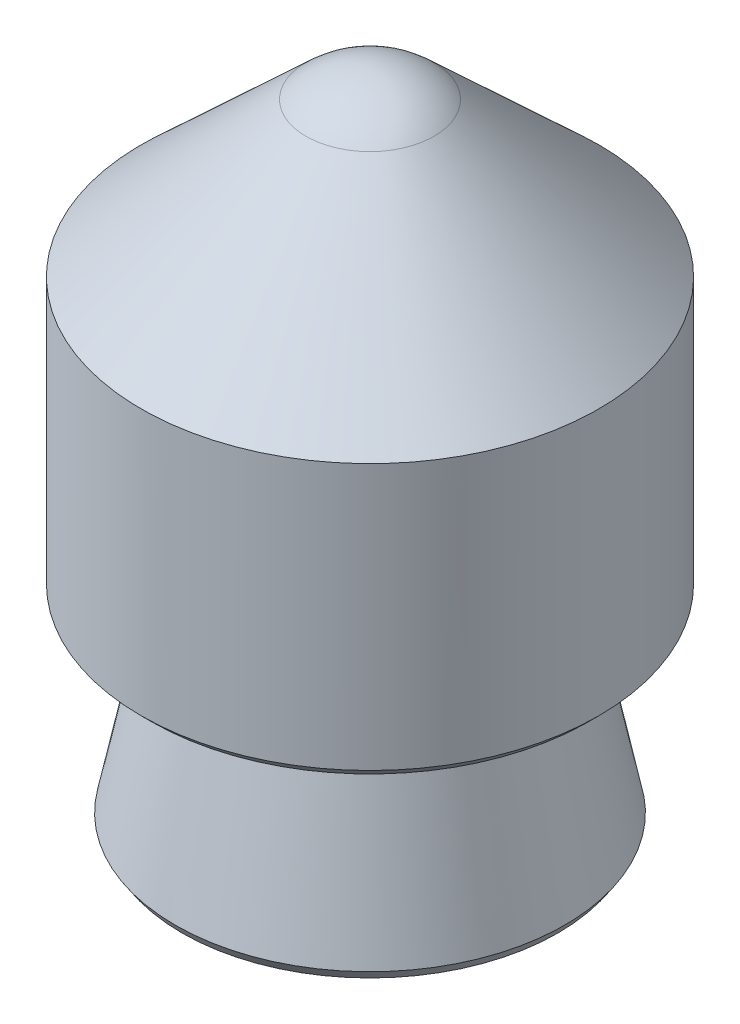
ISO-10303-21;
HEADER;
FILE_DESCRIPTION(('STEP AP214'),'2;1');
FILE_NAME('part.step','',(''),(''),'','','');
FILE_SCHEMA(('AUTOMOTIVE_DESIGN { 1 0 10303 214 1 1 1 1 }'));
ENDSEC;
DATA;
#1=APPLICATION_CONTEXT('core data for automotive mechanical design processes');
#2=APPLICATION_PROTOCOL_DEFINITION('international standard','automotive_design',2000,#1);
#3=PRODUCT_CONTEXT('',#1,'mechanical');
#4=PRODUCT('Part','Part','',(#3));
#5=PRODUCT_RELATED_PRODUCT_CATEGORY('part','',(#4));
#6=PRODUCT_DEFINITION_FORMATION('','',#4);
#7=PRODUCT_DEFINITION_CONTEXT('part definition',#1,'design');
#8=PRODUCT_DEFINITION('design','',#6,#7);
#9=PRODUCT_DEFINITION_SHAPE('','',#8);
#10=(LENGTH_UNIT() NAMED_UNIT(*) SI_UNIT(.MILLI.,.METRE.));
#11=(NAMED_UNIT(*) PLANE_ANGLE_UNIT() SI_UNIT($,.RADIAN.));
#12=(NAMED_UNIT(*) SI_UNIT($,.STERADIAN.) SOLID_ANGLE_UNIT());
#13=UNCERTAINTY_MEASURE_WITH_UNIT(LENGTH_MEASURE(1.E-05),#10,'distance_accuracy_value','');
#14=(GEOMETRIC_REPRESENTATION_CONTEXT(3) GLOBAL_UNCERTAINTY_ASSIGNED_CONTEXT((#13)) GLOBAL_UNIT_ASSIGNED_CONTEXT((#10,
#11,#12)) REPRESENTATION_CONTEXT('',''));
#15=CARTESIAN_POINT('',(0.,0.,0.));
#16=DIRECTION('',(0.,0.,1.));
#17=DIRECTION('',(1.,0.,0.));
#18=AXIS2_PLACEMENT_3D('',#15,#16,#17);
#19=CARTESIAN_POINT('',(0.,25.4,0.));
#20=DIRECTION('',(0.,1.,0.));
#21=DIRECTION('',(0.,0.,1.));
#22=AXIS2_PLACEMENT_3D('',#19,#20,#21);
#23=PLANE('',#22);
#24=CARTESIAN_POINT('',(0.,25.4,0.));
#25=DIRECTION('',(0.,-1.,0.));
#26=DIRECTION('',(0.,0.,-1.));
#27=AXIS2_PLACEMENT_3D('',#24,#25,#26);
#28=CIRCLE('',#27,3.5);
#29=CARTESIAN_POINT('',(0.,25.4,-3.5));
#30=VERTEX_POINT('',#29);
#31=EDGE_CURVE('E73',#30,#30,#28,.T.);
#32=ORIENTED_EDGE('',*,*,#31,.F.);
#33=EDGE_LOOP('',(#32));
#34=FACE_BOUND('',#33,.T.);
#35=CARTESIAN_POINT('',(0.,25.4,0.));
#36=DIRECTION('',(0.,1.,0.));
#37=DIRECTION('',(0.,0.,1.));
#38=AXIS2_PLACEMENT_3D('',#35,#36,#37);
#39=CIRCLE('',#38,4.59156114236063);
#40=CARTESIAN_POINT('',(0.,25.4,4.59156114236063));
#41=VERTEX_POINT('',#40);
#42=EDGE_CURVE('E58',#41,#41,#39,.F.);
#43=ORIENTED_EDGE('',*,*,#42,.T.);
#44=EDGE_LOOP('',(#43));
#45=FACE_BOUND('',#44,.T.);
#46=ADVANCED_FACE('F50',(#34,#45),#23,.F.);
#47=CARTESIAN_POINT('',(0.,30.2387,0.));
#48=DIRECTION('',(0.,-1.,0.));
#49=DIRECTION('',(0.,0.,-1.));
#50=AXIS2_PLACEMENT_3D('',#47,#48,#49);
#51=CONICAL_SURFACE('',#50,3.8227,0.200674236626133);
#52=CARTESIAN_POINT('',(0.,25.6489028308561,0.));
#53=DIRECTION('',(0.,1.,0.));
#54=DIRECTION('',(0.,0.,1.));
#55=AXIS2_PLACEMENT_3D('',#52,#53,#54);
#56=CIRCLE('',#55,4.75632015907782);
#57=CARTESIAN_POINT('',(0.,25.6489028308561,4.75632015907782));
#58=VERTEX_POINT('',#57);
#59=EDGE_CURVE('E13',#58,#58,#56,.T.);
#60=ORIENTED_EDGE('',*,*,#59,.T.);
#61=EDGE_LOOP('',(#60));
#62=FACE_BOUND('',#61,.T.);
#63=CARTESIAN_POINT('',(0.,30.2387,0.));
#64=DIRECTION('',(0.,-1.,0.));
#65=DIRECTION('',(0.,0.,-1.));
#66=AXIS2_PLACEMENT_3D('',#63,#64,#65);
#67=CIRCLE('',#66,3.8227);
#68=CARTESIAN_POINT('',(0.,30.2387,-3.8227));
#69=VERTEX_POINT('',#68);
#70=EDGE_CURVE('E86',#69,#69,#67,.T.);
#71=ORIENTED_EDGE('',*,*,#70,.T.);
#72=EDGE_LOOP('',(#71));
#73=FACE_BOUND('',#72,.T.);
#74=ADVANCED_FACE('F113',(#62,#73),#51,.T.);
#75=CARTESIAN_POINT('',(-3.8227,30.2387,0.));
#76=DIRECTION('',(0.,1.,0.));
#77=DIRECTION('',(0.,0.,1.));
#78=AXIS2_PLACEMENT_3D('',#75,#76,#77);
#79=PLANE('',#78);
#80=CARTESIAN_POINT('',(0.,30.2387,0.));
#81=DIRECTION('',(0.,1.,0.));
#82=DIRECTION('',(0.,0.,1.));
#83=AXIS2_PLACEMENT_3D('',#80,#81,#82);
#84=CIRCLE('',#83,5.334);
#85=CARTESIAN_POINT('',(0.,30.2387,5.334));
#86=VERTEX_POINT('',#85);
#87=EDGE_CURVE('E89',#86,#86,#84,.F.);
#88=ORIENTED_EDGE('',*,*,#87,.T.);
#89=EDGE_LOOP('',(#88));
#90=FACE_BOUND('',#89,.T.);
#91=ORIENTED_EDGE('',*,*,#70,.F.);
#92=EDGE_LOOP('',(#91));
#93=FACE_BOUND('',#92,.T.);
#94=ADVANCED_FACE('F119',(#90,#93),#79,.F.);
#95=CARTESIAN_POINT('',(0.,25.4,0.));
#96=DIRECTION('',(0.,-1.,0.));
#97=DIRECTION('',(0.,0.,-1.));
#98=AXIS2_PLACEMENT_3D('',#95,#96,#97);
#99=CYLINDRICAL_SURFACE('',#98,5.588);
#100=CARTESIAN_POINT('',(0.,30.4927,0.));
#101=DIRECTION('',(0.,1.,0.));
#102=DIRECTION('',(0.,0.,1.));
#103=AXIS2_PLACEMENT_3D('',#100,#101,#102);
#104=CIRCLE('',#103,5.588);
#105=CARTESIAN_POINT('',(0.,30.4927,5.588));
#106=VERTEX_POINT('',#105);
#107=EDGE_CURVE('E92',#106,#106,#104,.T.);
#108=ORIENTED_EDGE('',*,*,#107,.T.);
#109=EDGE_LOOP('',(#108));
#110=FACE_BOUND('',#109,.T.);
#111=CARTESIAN_POINT('',(0.,36.9824,0.));
#112=DIRECTION('',(0.,-1.,0.));
#113=DIRECTION('',(0.,0.,-1.));
#114=AXIS2_PLACEMENT_3D('',#111,#112,#113);
#115=CIRCLE('',#114,5.588);
#116=CARTESIAN_POINT('',(0.,36.9824,-5.588));
#117=VERTEX_POINT('',#116);
#118=EDGE_CURVE('E83',#117,#117,#115,.T.);
#119=ORIENTED_EDGE('',*,*,#118,.T.);
#120=EDGE_LOOP('',(#119));
#121=FACE_BOUND('',#120,.T.);
#122=ADVANCED_FACE('F126',(#110,#121),#99,.T.);
#123=CARTESIAN_POINT('',(0.,40.7353792951679,0.));
#124=DIRECTION('',(0.,-1.,0.));
#125=DIRECTION('',(0.,0.,-1.));
#126=AXIS2_PLACEMENT_3D('',#123,#124,#125);
#127=CONICAL_SURFACE('',#126,1.56336753354535,0.820311552481936);
#128=CARTESIAN_POINT('',(0.,40.7353792951679,0.));
#129=DIRECTION('',(0.,-1.,0.));
#130=DIRECTION('',(0.,0.,-1.));
#131=AXIS2_PLACEMENT_3D('',#128,#129,#130);
#132=CIRCLE('',#131,1.56336753354535);
#133=CARTESIAN_POINT('',(0.,40.7353792951679,-1.56336753354535));
#134=VERTEX_POINT('',#133);
#135=EDGE_CURVE('E78',#134,#134,#132,.T.);
#136=CARTESIAN_POINT('',(0.,36.9824,-5.588));
#137=CARTESIAN_POINT('',(0.,37.0214935343247,-5.54607674514109));
#138=CARTESIAN_POINT('',(0.,37.0605870686493,-5.50415349028219));
#139=CARTESIAN_POINT('',(0.,37.1387741372987,-5.42030698056439));
#140=CARTESIAN_POINT('',(0.,37.1778676716233,-5.37838372570548));
#141=CARTESIAN_POINT('',(0.,37.2560547402727,-5.29453721598768));
#142=CARTESIAN_POINT('',(0.,37.2951482745973,-5.25261396112878));
#143=CARTESIAN_POINT('',(0.,37.3733353432467,-5.16876745141097));
#144=CARTESIAN_POINT('',(0.,37.4124288775713,-5.12684419655207));
#145=CARTESIAN_POINT('',(0.,37.4906159462207,-5.04299768683426));
#146=CARTESIAN_POINT('',(0.,37.5297094805453,-5.00107443197536));
#147=CARTESIAN_POINT('',(0.,37.6078965491947,-4.91722792225756));
#148=CARTESIAN_POINT('',(0.,37.6469900835193,-4.87530466739865));
#149=CARTESIAN_POINT('',(0.,37.7251771521687,-4.79145815768085));
#150=CARTESIAN_POINT('',(0.,37.7642706864933,-4.74953490282195));
#151=CARTESIAN_POINT('',(0.,37.8424577551427,-4.66568839310414));
#152=CARTESIAN_POINT('',(0.,37.8815512894673,-4.62376513824524));
#153=CARTESIAN_POINT('',(0.,37.9597383581166,-4.53991862852743));
#154=CARTESIAN_POINT('',(0.,37.9988318924413,-4.49799537366853));
#155=CARTESIAN_POINT('',(0.,38.0770189610907,-4.41414886395073));
#156=CARTESIAN_POINT('',(0.,38.1161124954153,-4.37222560909182));
#157=CARTESIAN_POINT('',(0.,38.1942995640647,-4.28837909937402));
#158=CARTESIAN_POINT('',(0.,38.2333930983893,-4.24645584451511));
#159=CARTESIAN_POINT('',(0.,38.3115801670386,-4.16260933479731));
#160=CARTESIAN_POINT('',(0.,38.3506737013633,-4.12068607993841));
#161=CARTESIAN_POINT('',(0.,38.4288607700126,-4.0368395702206));
#162=CARTESIAN_POINT('',(0.,38.4679543043373,-3.9949163153617));
#163=CARTESIAN_POINT('',(0.,38.5461413729866,-3.91106980564389));
#164=CARTESIAN_POINT('',(0.,38.5852349073113,-3.86914655078499));
#165=CARTESIAN_POINT('',(0.,38.6634219759606,-3.78530004106719));
#166=CARTESIAN_POINT('',(0.,38.7025155102853,-3.74337678620828));
#167=CARTESIAN_POINT('',(0.,38.7807025789346,-3.65953027649048));
#168=CARTESIAN_POINT('',(0.,38.8197961132593,-3.61760702163158));
#169=CARTESIAN_POINT('',(0.,38.8979831819086,-3.53376051191377));
#170=CARTESIAN_POINT('',(0.,38.9370767162333,-3.49183725705487));
#171=CARTESIAN_POINT('',(0.,39.0152637848826,-3.40799074733706));
#172=CARTESIAN_POINT('',(0.,39.0543573192073,-3.36606749247816));
#173=CARTESIAN_POINT('',(0.,39.1325443878566,-3.28222098276036));
#174=CARTESIAN_POINT('',(0.,39.1716379221813,-3.24029772790145));
#175=CARTESIAN_POINT('',(0.,39.2498249908306,-3.15645121818365));
#176=CARTESIAN_POINT('',(0.,39.2889185251553,-3.11452796332474));
#177=CARTESIAN_POINT('',(0.,39.3671055938046,-3.03068145360694));
#178=CARTESIAN_POINT('',(0.,39.4061991281293,-2.98875819874804));
#179=CARTESIAN_POINT('',(0.,39.4843861967786,-2.90491168903023));
#180=CARTESIAN_POINT('',(0.,39.5234797311033,-2.86298843417133));
#181=CARTESIAN_POINT('',(0.,39.6016667997526,-2.77914192445353));
#182=CARTESIAN_POINT('',(0.,39.6407603340773,-2.73721866959462));
#183=CARTESIAN_POINT('',(0.,39.7189474027266,-2.65337215987682));
#184=CARTESIAN_POINT('',(0.,39.7580409370513,-2.61144890501791));
#185=CARTESIAN_POINT('',(0.,39.8362280057006,-2.52760239530011));
#186=CARTESIAN_POINT('',(0.,39.8753215400253,-2.48567914044121));
#187=CARTESIAN_POINT('',(0.,39.9535086086746,-2.4018326307234));
#188=CARTESIAN_POINT('',(0.,39.9926021429993,-2.3599093758645));
#189=CARTESIAN_POINT('',(0.,40.0707892116486,-2.27606286614669));
#190=CARTESIAN_POINT('',(0.,40.1098827459733,-2.23413961128779));
#191=CARTESIAN_POINT('',(0.,40.1880698146226,-2.15029310156999));
#192=CARTESIAN_POINT('',(0.,40.2271633489473,-2.10836984671108));
#193=CARTESIAN_POINT('',(0.,40.3053504175966,-2.02452333699328));
#194=CARTESIAN_POINT('',(0.,40.3444439519213,-1.98260008213437));
#195=CARTESIAN_POINT('',(0.,40.4226310205706,-1.89875357241657));
#196=CARTESIAN_POINT('',(0.,40.4617245548953,-1.85683031755767));
#197=CARTESIAN_POINT('',(0.,40.5399116235446,-1.77298380783986));
#198=CARTESIAN_POINT('',(0.,40.5790051578693,-1.73106055298096));
#199=CARTESIAN_POINT('',(0.,40.6571922265186,-1.64721404326315));
#200=CARTESIAN_POINT('',(0.,40.6962857608433,-1.60529078840425));
#201=CARTESIAN_POINT('',(0.,40.7353792951679,-1.56336753354535));
#202=B_SPLINE_CURVE_WITH_KNOTS('',3,(#136,#137,#138,#139,#140,#141,#142,#143,#144,#145,#146,
#147,#148,#149,#150,#151,#152,#153,#154,#155,#156,#157,#158,#159,#160,#161,#162,#163,#164,#165,
#166,#167,#168,#169,#170,#171,#172,#173,#174,#175,#176,#177,#178,#179,#180,#181,#182,#183,#184,
#185,#186,#187,#188,#189,#190,#191,#192,#193,#194,#195,#196,#197,#198,#199,#200,#201),
.UNSPECIFIED.,.F.,.F.,(4,2,2,2,2,2,2,2,2,2,2,2,2,2,2,2,2,2,2,2,2,2,2,2,2,2,2,2,2,2,2,2,4),(0.,
0.171967361774338,0.343934723548674,0.515902085323008,0.68786944709734,0.859836808871678,
1.03180417064602,1.20377153242035,1.37573889419468,1.54770625596902,1.71967361774336,
1.89164097951769,2.06360834129202,2.23557570306636,2.4075430648407,2.57951042661503,
2.75147778838936,2.9234451501637,3.09541251193804,3.26737987371237,3.4393472354867,
3.61131459726104,3.78328195903538,3.95524932080971,4.12721668258404,4.29918404435838,
4.47115140613272,4.64311876790705,4.81508612968138,4.98705349145572,5.15902085323006,
5.33098821500439,5.50295557677872),.UNSPECIFIED.);
#203=EDGE_CURVE('BSEAM130',#117,#134,#202,.T.);
#204=ORIENTED_EDGE('',*,*,#118,.F.);
#205=ORIENTED_EDGE('',*,*,#135,.T.);
#206=ORIENTED_EDGE('',*,*,#203,.T.);
#207=ORIENTED_EDGE('',*,*,#203,.F.);
#208=EDGE_LOOP('',(#204,#206,#205,#207));
#209=FACE_BOUND('',#208,.T.);
#210=ADVANCED_FACE('F130',(#209),#127,.T.);
#211=CARTESIAN_POINT('',(0.,39.05885,0.));
#212=DIRECTION('',(0.,-1.,0.));
#213=DIRECTION('',(-1.,0.,0.));
#214=AXIS2_PLACEMENT_3D('',#211,#212,#213);
#215=SPHERICAL_SURFACE('',#214,2.29235);
#216=ORIENTED_EDGE('',*,*,#135,.F.);
#217=EDGE_LOOP('',(#216));
#218=FACE_BOUND('',#217,.T.);
#219=ADVANCED_FACE('F109',(#218),#215,.T.);
#220=CARTESIAN_POINT('',(0.,30.2387,0.));
#221=DIRECTION('',(0.,1.,0.));
#222=DIRECTION('',(0.,0.,1.));
#223=AXIS2_PLACEMENT_3D('',#220,#221,#222);
#224=CONICAL_SURFACE('',#223,5.334,0.785398163397443);
#225=ORIENTED_EDGE('',*,*,#107,.F.);
#226=EDGE_LOOP('',(#225));
#227=FACE_BOUND('',#226,.T.);
#228=ORIENTED_EDGE('',*,*,#87,.F.);
#229=EDGE_LOOP('',(#228));
#230=FACE_BOUND('',#229,.T.);
#231=ADVANCED_FACE('F101',(#227,#230),#224,.T.);
#232=CARTESIAN_POINT('',(0.,25.4,0.));
#233=DIRECTION('',(0.,1.,0.));
#234=DIRECTION('',(0.,0.,1.));
#235=AXIS2_PLACEMENT_3D('',#232,#233,#234);
#236=CONICAL_SURFACE('',#235,4.59156114236063,0.584723926771309);
#237=ORIENTED_EDGE('',*,*,#59,.F.);
#238=EDGE_LOOP('',(#237));
#239=FACE_BOUND('',#238,.T.);
#240=ORIENTED_EDGE('',*,*,#42,.F.);
#241=EDGE_LOOP('',(#240));
#242=FACE_BOUND('',#241,.T.);
#243=ADVANCED_FACE('F52',(#239,#242),#236,.T.);
#244=CARTESIAN_POINT('',(0.,27.9,0.));
#245=DIRECTION('',(0.,-1.,0.));
#246=DIRECTION('',(0.,0.,-1.));
#247=AXIS2_PLACEMENT_3D('',#244,#245,#246);
#248=CYLINDRICAL_SURFACE('',#247,3.5);
#249=CARTESIAN_POINT('',(0.,27.9,0.));
#250=DIRECTION('',(0.,-1.,0.));
#251=DIRECTION('',(0.,0.,-1.));
#252=AXIS2_PLACEMENT_3D('',#249,#250,#251);
#253=CIRCLE('',#252,3.5);
#254=CARTESIAN_POINT('',(0.,27.9,-3.5));
#255=VERTEX_POINT('',#254);
#256=EDGE_CURVE('E75',#255,#255,#253,.T.);
#257=ORIENTED_EDGE('',*,*,#256,.F.);
#258=EDGE_LOOP('',(#257));
#259=FACE_BOUND('',#258,.T.);
#260=ORIENTED_EDGE('',*,*,#31,.T.);
#261=EDGE_LOOP('',(#260));
#262=FACE_BOUND('',#261,.T.);
#263=ADVANCED_FACE('F100',(#259,#262),#248,.F.);
#264=CARTESIAN_POINT('',(0.,27.9,0.));
#265=DIRECTION('',(0.,-1.,0.));
#266=DIRECTION('',(0.,0.,-1.));
#267=AXIS2_PLACEMENT_3D('',#264,#265,#266);
#268=PLANE('',#267);
#269=CARTESIAN_POINT('',(0.,27.9,0.));
#270=DIRECTION('',(0.,-1.,0.));
#271=DIRECTION('',(0.,0.,-1.));
#272=AXIS2_PLACEMENT_3D('',#269,#270,#271);
#273=CIRCLE('',#272,2.99999999999999);
#274=CARTESIAN_POINT('',(0.,27.9,-2.99999999999999));
#275=VERTEX_POINT('',#274);
#276=EDGE_CURVE('E54',#275,#275,#273,.T.);
#277=ORIENTED_EDGE('',*,*,#276,.F.);
#278=EDGE_LOOP('',(#277));
#279=FACE_BOUND('',#278,.T.);
#280=ORIENTED_EDGE('',*,*,#256,.T.);
#281=EDGE_LOOP('',(#280));
#282=FACE_BOUND('',#281,.T.);
#283=ADVANCED_FACE('F65',(#279,#282),#268,.T.);
#284=CARTESIAN_POINT('',(0.,36.354004,0.));
#285=DIRECTION('',(0.,-1.,0.));
#286=DIRECTION('',(0.,0.,-1.));
#287=AXIS2_PLACEMENT_3D('',#284,#285,#286);
#288=CONICAL_SURFACE('',#287,3.,1.02974425867665);
#289=CARTESIAN_POINT('',(0.,38.1565858570827,0.));
#290=VERTEX_POINT('',#289);
#291=VERTEX_LOOP('',#290);
#292=FACE_BOUND('',#291,.T.);
#293=CARTESIAN_POINT('',(0.,36.354004,0.));
#294=DIRECTION('',(0.,-1.,0.));
#295=DIRECTION('',(0.,0.,-1.));
#296=AXIS2_PLACEMENT_3D('',#293,#294,#295);
#297=CIRCLE('',#296,3.);
#298=CARTESIAN_POINT('',(0.,36.354004,-3.));
#299=VERTEX_POINT('',#298);
#300=EDGE_CURVE('E69',#299,#299,#297,.T.);
#301=ORIENTED_EDGE('',*,*,#300,.T.);
#302=EDGE_LOOP('',(#301));
#303=FACE_BOUND('',#302,.T.);
#304=ADVANCED_FACE('F61',(#292,#303),#288,.F.);
#305=CARTESIAN_POINT('',(0.,25.4,0.));
#306=DIRECTION('',(0.,-1.,0.));
#307=DIRECTION('',(0.,0.,-1.));
#308=AXIS2_PLACEMENT_3D('',#305,#306,#307);
#309=CYLINDRICAL_SURFACE('',#308,2.99999999999999);
#310=ORIENTED_EDGE('',*,*,#276,.T.);
#311=EDGE_LOOP('',(#310));
#312=FACE_BOUND('',#311,.T.);
#313=ORIENTED_EDGE('',*,*,#300,.F.);
#314=EDGE_LOOP('',(#313));
#315=FACE_BOUND('',#314,.T.);
#316=ADVANCED_FACE('F64',(#312,#315),#309,.F.);
#317=CLOSED_SHELL('',(#46,#74,#94,#122,#210,#219,#231,#243,#263,#283,#304,#316));
#318=MANIFOLD_SOLID_BREP('B2',#317);
#319=ADVANCED_BREP_SHAPE_REPRESENTATION('',(#18,#318),#14);
#320=SHAPE_DEFINITION_REPRESENTATION(#9,#319);
ENDSEC;
END-ISO-10303-21;
